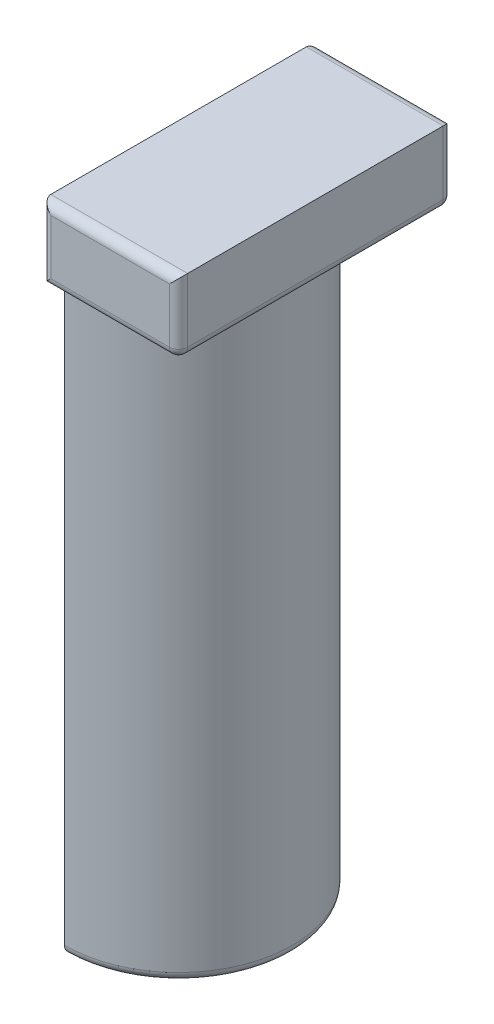
ISO-10303-21;
HEADER;
FILE_DESCRIPTION(('STEP AP214'),'2;1');
FILE_NAME('part.step','',(''),(''),'','','');
FILE_SCHEMA(('AUTOMOTIVE_DESIGN { 1 0 10303 214 1 1 1 1 }'));
ENDSEC;
DATA;
#1=APPLICATION_CONTEXT('core data for automotive mechanical design processes');
#2=APPLICATION_PROTOCOL_DEFINITION('international standard','automotive_design',2000,#1);
#3=PRODUCT_CONTEXT('',#1,'mechanical');
#4=PRODUCT('Part','Part','',(#3));
#5=PRODUCT_RELATED_PRODUCT_CATEGORY('part','',(#4));
#6=PRODUCT_DEFINITION_FORMATION('','',#4);
#7=PRODUCT_DEFINITION_CONTEXT('part definition',#1,'design');
#8=PRODUCT_DEFINITION('design','',#6,#7);
#9=PRODUCT_DEFINITION_SHAPE('','',#8);
#10=(LENGTH_UNIT() NAMED_UNIT(*) SI_UNIT(.MILLI.,.METRE.));
#11=(NAMED_UNIT(*) PLANE_ANGLE_UNIT() SI_UNIT($,.RADIAN.));
#12=(NAMED_UNIT(*) SI_UNIT($,.STERADIAN.) SOLID_ANGLE_UNIT());
#13=UNCERTAINTY_MEASURE_WITH_UNIT(LENGTH_MEASURE(1.E-05),#10,'distance_accuracy_value','');
#14=(GEOMETRIC_REPRESENTATION_CONTEXT(3) GLOBAL_UNCERTAINTY_ASSIGNED_CONTEXT((#13)) GLOBAL_UNIT_ASSIGNED_CONTEXT((#10,
#11,#12)) REPRESENTATION_CONTEXT('',''));
#15=CARTESIAN_POINT('',(0.,0.,0.));
#16=DIRECTION('',(0.,0.,1.));
#17=DIRECTION('',(1.,0.,0.));
#18=AXIS2_PLACEMENT_3D('',#15,#16,#17);
#19=CARTESIAN_POINT('',(0.,8.,0.));
#20=DIRECTION('',(-1.,0.,0.));
#21=DIRECTION('',(0.,0.,1.));
#22=AXIS2_PLACEMENT_3D('',#19,#20,#21);
#23=PLANE('',#22);
#24=DIRECTION('',(0.,0.,-1.));
#25=VECTOR('',#24,1.);
#26=CARTESIAN_POINT('',(0.,1.,0.));
#27=LINE('',#26,#25);
#28=CARTESIAN_POINT('',(0.,1.,-1.));
#29=VERTEX_POINT('',#28);
#30=CARTESIAN_POINT('',(0.,1.,-29.));
#31=VERTEX_POINT('',#30);
#32=EDGE_CURVE('E177',#29,#31,#27,.T.);
#33=ORIENTED_EDGE('',*,*,#32,.T.);
#34=DIRECTION('',(0.,-1.,0.));
#35=VECTOR('',#34,1.);
#36=CARTESIAN_POINT('',(0.,8.,-29.));
#37=LINE('',#36,#35);
#38=CARTESIAN_POINT('',(0.,8.,-29.));
#39=VERTEX_POINT('',#38);
#40=EDGE_CURVE('E181',#31,#39,#37,.F.);
#41=ORIENTED_EDGE('',*,*,#40,.T.);
#42=DIRECTION('',(0.,0.,-1.));
#43=VECTOR('',#42,1.);
#44=CARTESIAN_POINT('',(0.,8.,0.));
#45=LINE('',#44,#43);
#46=CARTESIAN_POINT('',(0.,8.,-1.));
#47=VERTEX_POINT('',#46);
#48=EDGE_CURVE('E153',#47,#39,#45,.T.);
#49=ORIENTED_EDGE('',*,*,#48,.F.);
#50=DIRECTION('',(0.,-1.,0.));
#51=VECTOR('',#50,1.);
#52=CARTESIAN_POINT('',(0.,8.,-1.));
#53=LINE('',#52,#51);
#54=EDGE_CURVE('E179',#47,#29,#53,.T.);
#55=ORIENTED_EDGE('',*,*,#54,.T.);
#56=EDGE_LOOP('',(#33,#41,#49,#55));
#57=FACE_BOUND('',#56,.T.);
#58=ADVANCED_FACE('F37',(#57),#23,.F.);
#59=CARTESIAN_POINT('',(0.,8.,-30.));
#60=DIRECTION('',(0.,0.,1.));
#61=DIRECTION('',(1.,0.,0.));
#62=AXIS2_PLACEMENT_3D('',#59,#60,#61);
#63=PLANE('',#62);
#64=DIRECTION('',(-1.,0.,0.));
#65=VECTOR('',#64,1.);
#66=CARTESIAN_POINT('',(0.,7.,-30.));
#67=LINE('',#66,#65);
#68=CARTESIAN_POINT('',(-14.,7.,-30.));
#69=VERTEX_POINT('',#68);
#70=CARTESIAN_POINT('',(-1.,7.,-30.));
#71=VERTEX_POINT('',#70);
#72=EDGE_CURVE('E172',#69,#71,#67,.F.);
#73=ORIENTED_EDGE('',*,*,#72,.T.);
#74=DIRECTION('',(0.,-1.,0.));
#75=VECTOR('',#74,1.);
#76=CARTESIAN_POINT('',(-1.,8.,-30.));
#77=LINE('',#76,#75);
#78=CARTESIAN_POINT('',(-1.,1.,-30.));
#79=VERTEX_POINT('',#78);
#80=EDGE_CURVE('E174',#71,#79,#77,.T.);
#81=ORIENTED_EDGE('',*,*,#80,.T.);
#82=DIRECTION('',(-1.,0.,0.));
#83=VECTOR('',#82,1.);
#84=CARTESIAN_POINT('',(0.,1.,-30.));
#85=LINE('',#84,#83);
#86=CARTESIAN_POINT('',(-14.,1.,-30.));
#87=VERTEX_POINT('',#86);
#88=EDGE_CURVE('E168',#79,#87,#85,.T.);
#89=ORIENTED_EDGE('',*,*,#88,.T.);
#90=DIRECTION('',(0.,1.,0.));
#91=VECTOR('',#90,1.);
#92=CARTESIAN_POINT('',(-14.,8.,-30.));
#93=LINE('',#92,#91);
#94=EDGE_CURVE('E170',#87,#69,#93,.T.);
#95=ORIENTED_EDGE('',*,*,#94,.T.);
#96=EDGE_LOOP('',(#73,#81,#89,#95));
#97=FACE_BOUND('',#96,.T.);
#98=ADVANCED_FACE('F252',(#97),#63,.F.);
#99=CARTESIAN_POINT('',(0.,8.,0.));
#100=DIRECTION('',(0.,0.,-1.));
#101=DIRECTION('',(-1.,0.,0.));
#102=AXIS2_PLACEMENT_3D('',#99,#100,#101);
#103=PLANE('',#102);
#104=DIRECTION('',(1.,0.,0.));
#105=VECTOR('',#104,1.);
#106=CARTESIAN_POINT('',(0.,1.,0.));
#107=LINE('',#106,#105);
#108=CARTESIAN_POINT('',(-14.,1.,0.));
#109=VERTEX_POINT('',#108);
#110=CARTESIAN_POINT('',(-1.,1.,0.));
#111=VERTEX_POINT('',#110);
#112=EDGE_CURVE('E46',#109,#111,#107,.T.);
#113=ORIENTED_EDGE('',*,*,#112,.T.);
#114=DIRECTION('',(0.,-1.,0.));
#115=VECTOR('',#114,1.);
#116=CARTESIAN_POINT('',(-1.,8.,0.));
#117=LINE('',#116,#115);
#118=CARTESIAN_POINT('',(-1.,7.,0.));
#119=VERTEX_POINT('',#118);
#120=EDGE_CURVE('E11',#111,#119,#117,.F.);
#121=ORIENTED_EDGE('',*,*,#120,.T.);
#122=DIRECTION('',(1.,0.,0.));
#123=VECTOR('',#122,1.);
#124=CARTESIAN_POINT('',(-15.,7.,0.));
#125=LINE('',#124,#123);
#126=CARTESIAN_POINT('',(-14.,7.,0.));
#127=VERTEX_POINT('',#126);
#128=EDGE_CURVE('E197',#119,#127,#125,.F.);
#129=ORIENTED_EDGE('',*,*,#128,.T.);
#130=DIRECTION('',(0.,1.,0.));
#131=VECTOR('',#130,1.);
#132=CARTESIAN_POINT('',(-14.,8.,0.));
#133=LINE('',#132,#131);
#134=EDGE_CURVE('E57',#127,#109,#133,.F.);
#135=ORIENTED_EDGE('',*,*,#134,.T.);
#136=EDGE_LOOP('',(#113,#121,#129,#135));
#137=FACE_BOUND('',#136,.T.);
#138=ADVANCED_FACE('F285',(#137),#103,.F.);
#139=CARTESIAN_POINT('',(0.,8.,0.));
#140=DIRECTION('',(0.,1.,0.));
#141=DIRECTION('',(0.,0.,1.));
#142=AXIS2_PLACEMENT_3D('',#139,#140,#141);
#143=PLANE('',#142);
#144=ORIENTED_EDGE('',*,*,#48,.T.);
#145=DIRECTION('',(-1.,0.,0.));
#146=VECTOR('',#145,1.);
#147=CARTESIAN_POINT('',(-15.,8.,-29.));
#148=LINE('',#147,#146);
#149=CARTESIAN_POINT('',(-15.,8.,-29.));
#150=VERTEX_POINT('',#149);
#151=EDGE_CURVE('E186',#39,#150,#148,.T.);
#152=ORIENTED_EDGE('',*,*,#151,.T.);
#153=DIRECTION('',(0.,0.,-1.));
#154=VECTOR('',#153,1.);
#155=CARTESIAN_POINT('',(-15.,8.,-30.));
#156=LINE('',#155,#154);
#157=CARTESIAN_POINT('',(-15.,8.,-0.999999999999997));
#158=VERTEX_POINT('',#157);
#159=EDGE_CURVE('E147',#158,#150,#156,.T.);
#160=ORIENTED_EDGE('',*,*,#159,.F.);
#161=DIRECTION('',(1.,0.,0.));
#162=VECTOR('',#161,1.);
#163=CARTESIAN_POINT('',(0.,8.,-1.));
#164=LINE('',#163,#162);
#165=EDGE_CURVE('E184',#158,#47,#164,.T.);
#166=ORIENTED_EDGE('',*,*,#165,.T.);
#167=EDGE_LOOP('',(#144,#152,#160,#166));
#168=FACE_BOUND('',#167,.T.);
#169=ADVANCED_FACE('F408',(#168),#143,.T.);
#170=CARTESIAN_POINT('',(0.,0.,0.));
#171=DIRECTION('',(0.,1.,0.));
#172=DIRECTION('',(0.,0.,1.));
#173=AXIS2_PLACEMENT_3D('',#170,#171,#172);
#174=PLANE('',#173);
#175=DIRECTION('',(0.,0.,-1.));
#176=VECTOR('',#175,1.);
#177=CARTESIAN_POINT('',(-15.,0.,0.));
#178=LINE('',#177,#176);
#179=CARTESIAN_POINT('',(-15.,0.,-27.5));
#180=VERTEX_POINT('',#179);
#181=CARTESIAN_POINT('',(-15.,0.,-29.));
#182=VERTEX_POINT('',#181);
#183=EDGE_CURVE('E139',#180,#182,#178,.T.);
#184=ORIENTED_EDGE('',*,*,#183,.T.);
#185=DIRECTION('',(-1.,0.,0.));
#186=VECTOR('',#185,1.);
#187=CARTESIAN_POINT('',(0.,0.,-29.));
#188=LINE('',#187,#186);
#189=CARTESIAN_POINT('',(-1.,0.,-29.));
#190=VERTEX_POINT('',#189);
#191=EDGE_CURVE('E195',#182,#190,#188,.F.);
#192=ORIENTED_EDGE('',*,*,#191,.T.);
#193=DIRECTION('',(0.,0.,-1.));
#194=VECTOR('',#193,1.);
#195=CARTESIAN_POINT('',(-1.,0.,0.));
#196=LINE('',#195,#194);
#197=CARTESIAN_POINT('',(-1.,0.,-1.));
#198=VERTEX_POINT('',#197);
#199=EDGE_CURVE('E192',#190,#198,#196,.F.);
#200=ORIENTED_EDGE('',*,*,#199,.T.);
#201=DIRECTION('',(1.,0.,0.));
#202=VECTOR('',#201,1.);
#203=CARTESIAN_POINT('',(0.,0.,-1.));
#204=LINE('',#203,#202);
#205=CARTESIAN_POINT('',(-15.,0.,-1.));
#206=VERTEX_POINT('',#205);
#207=EDGE_CURVE('E133',#198,#206,#204,.F.);
#208=ORIENTED_EDGE('',*,*,#207,.T.);
#209=CARTESIAN_POINT('',(-15.,0.,-2.5));
#210=VERTEX_POINT('',#209);
#211=EDGE_CURVE('E126',#206,#210,#178,.T.);
#212=ORIENTED_EDGE('',*,*,#211,.T.);
#213=CARTESIAN_POINT('',(-15.,0.,-15.));
#214=DIRECTION('',(0.,-1.,0.));
#215=DIRECTION('',(0.,0.,-1.));
#216=AXIS2_PLACEMENT_3D('',#213,#214,#215);
#217=CIRCLE('',#216,12.5);
#218=EDGE_CURVE('E131',#180,#210,#217,.T.);
#219=ORIENTED_EDGE('',*,*,#218,.F.);
#220=EDGE_LOOP('',(#184,#192,#200,#208,#212,#219));
#221=FACE_BOUND('',#220,.T.);
#222=ADVANCED_FACE('F129',(#221),#174,.F.);
#223=CARTESIAN_POINT('',(-15.,-65.,-15.));
#224=DIRECTION('',(0.,1.,0.));
#225=DIRECTION('',(0.,0.,1.));
#226=AXIS2_PLACEMENT_3D('',#223,#224,#225);
#227=CYLINDRICAL_SURFACE('',#226,12.5);
#228=DIRECTION('',(0.,1.,0.));
#229=VECTOR('',#228,1.);
#230=CARTESIAN_POINT('',(-15.,-65.,-2.5));
#231=LINE('',#230,#229);
#232=CARTESIAN_POINT('',(-15.,-64.,-2.5));
#233=VERTEX_POINT('',#232);
#234=EDGE_CURVE('E137',#210,#233,#231,.F.);
#235=ORIENTED_EDGE('',*,*,#234,.T.);
#236=CARTESIAN_POINT('',(-15.,-64.,-15.));
#237=DIRECTION('',(0.,-1.,0.));
#238=DIRECTION('',(0.,0.,-1.));
#239=AXIS2_PLACEMENT_3D('',#236,#237,#238);
#240=CIRCLE('',#239,12.5);
#241=CARTESIAN_POINT('',(-15.,-64.,-27.5));
#242=VERTEX_POINT('',#241);
#243=EDGE_CURVE('E166',#233,#242,#240,.F.);
#244=ORIENTED_EDGE('',*,*,#243,.T.);
#245=DIRECTION('',(0.,1.,0.));
#246=VECTOR('',#245,1.);
#247=CARTESIAN_POINT('',(-15.,-65.,-27.5));
#248=LINE('',#247,#246);
#249=EDGE_CURVE('E136',#242,#180,#248,.T.);
#250=ORIENTED_EDGE('',*,*,#249,.T.);
#251=ORIENTED_EDGE('',*,*,#218,.T.);
#252=EDGE_LOOP('',(#235,#244,#250,#251));
#253=FACE_BOUND('',#252,.T.);
#254=ADVANCED_FACE('F149',(#253),#227,.T.);
#255=CARTESIAN_POINT('',(-15.,-65.,-15.));
#256=DIRECTION('',(0.,-1.,0.));
#257=DIRECTION('',(0.,0.,-1.));
#258=AXIS2_PLACEMENT_3D('',#255,#256,#257);
#259=PLANE('',#258);
#260=DIRECTION('',(0.,0.,1.));
#261=VECTOR('',#260,1.);
#262=CARTESIAN_POINT('',(-15.,-65.,-15.));
#263=LINE('',#262,#261);
#264=CARTESIAN_POINT('',(-15.,-65.,-26.5));
#265=VERTEX_POINT('',#264);
#266=CARTESIAN_POINT('',(-15.,-65.,-3.5));
#267=VERTEX_POINT('',#266);
#268=EDGE_CURVE('E152',#265,#267,#263,.T.);
#269=ORIENTED_EDGE('',*,*,#268,.F.);
#270=CARTESIAN_POINT('',(-15.,-65.,-15.));
#271=DIRECTION('',(0.,-1.,0.));
#272=DIRECTION('',(0.,0.,-1.));
#273=AXIS2_PLACEMENT_3D('',#270,#271,#272);
#274=CIRCLE('',#273,11.5);
#275=EDGE_CURVE('E155',#265,#267,#274,.T.);
#276=ORIENTED_EDGE('',*,*,#275,.T.);
#277=EDGE_LOOP('',(#269,#276));
#278=FACE_BOUND('',#277,.T.);
#279=ADVANCED_FACE('F386',(#278),#259,.T.);
#280=CARTESIAN_POINT('',(-15.,-65.,-30.));
#281=DIRECTION('',(1.,0.,0.));
#282=DIRECTION('',(0.,1.,0.));
#283=AXIS2_PLACEMENT_3D('',#280,#281,#282);
#284=PLANE('',#283);
#285=ORIENTED_EDGE('',*,*,#159,.T.);
#286=DIRECTION('',(0.,1.,0.));
#287=VECTOR('',#286,1.);
#288=CARTESIAN_POINT('',(-15.,-65.,-29.));
#289=LINE('',#288,#287);
#290=EDGE_CURVE('E190',#150,#182,#289,.F.);
#291=ORIENTED_EDGE('',*,*,#290,.T.);
#292=ORIENTED_EDGE('',*,*,#183,.F.);
#293=ORIENTED_EDGE('',*,*,#249,.F.);
#294=CARTESIAN_POINT('',(-15.,-64.,-26.5));
#295=DIRECTION('',(1.,0.,0.));
#296=DIRECTION('',(0.,1.,0.));
#297=AXIS2_PLACEMENT_3D('',#294,#295,#296);
#298=CIRCLE('',#297,1.);
#299=EDGE_CURVE('E163',#242,#265,#298,.F.);
#300=ORIENTED_EDGE('',*,*,#299,.T.);
#301=ORIENTED_EDGE('',*,*,#268,.T.);
#302=CARTESIAN_POINT('',(-15.,-64.,-3.5));
#303=DIRECTION('',(1.,0.,0.));
#304=DIRECTION('',(0.,1.,0.));
#305=AXIS2_PLACEMENT_3D('',#302,#303,#304);
#306=CIRCLE('',#305,1.);
#307=EDGE_CURVE('E144',#267,#233,#306,.F.);
#308=ORIENTED_EDGE('',*,*,#307,.T.);
#309=ORIENTED_EDGE('',*,*,#234,.F.);
#310=ORIENTED_EDGE('',*,*,#211,.F.);
#311=DIRECTION('',(0.,1.,0.));
#312=VECTOR('',#311,1.);
#313=CARTESIAN_POINT('',(-15.,-65.,-1.));
#314=LINE('',#313,#312);
#315=EDGE_CURVE('E188',#206,#158,#314,.T.);
#316=ORIENTED_EDGE('',*,*,#315,.T.);
#317=EDGE_LOOP('',(#285,#291,#292,#293,#300,#301,#308,#309,#310,#316));
#318=FACE_BOUND('',#317,.T.);
#319=ADVANCED_FACE('F142',(#318),#284,.F.);
#320=CARTESIAN_POINT('',(-15.,-64.,-15.));
#321=DIRECTION('',(0.,-1.,0.));
#322=DIRECTION('',(0.,0.,-1.));
#323=AXIS2_PLACEMENT_3D('',#320,#321,#322);
#324=TOROIDAL_SURFACE('',#323,11.5,1.);
#325=ORIENTED_EDGE('',*,*,#299,.F.);
#326=ORIENTED_EDGE('',*,*,#243,.F.);
#327=ORIENTED_EDGE('',*,*,#307,.F.);
#328=ORIENTED_EDGE('',*,*,#275,.F.);
#329=EDGE_LOOP('',(#325,#326,#327,#328));
#330=FACE_BOUND('',#329,.T.);
#331=ADVANCED_FACE('F289',(#330),#324,.T.);
#332=CARTESIAN_POINT('',(-14.,-65.,-1.));
#333=DIRECTION('',(0.,1.,0.));
#334=DIRECTION('',(-1.,0.,0.));
#335=AXIS2_PLACEMENT_3D('',#332,#333,#334);
#336=CYLINDRICAL_SURFACE('',#335,1.);
#337=CARTESIAN_POINT('',(-14.,1.,-1.));
#338=DIRECTION('',(-0.707106781186547,0.707106781186547,0.));
#339=DIRECTION('',(0.707106781186547,0.707106781186547,0.));
#340=AXIS2_PLACEMENT_3D('',#337,#338,#339);
#341=ELLIPSE('',#340,1.41421356237309,1.);
#342=EDGE_CURVE('E227',#109,#206,#341,.F.);
#343=ORIENTED_EDGE('',*,*,#342,.F.);
#344=ORIENTED_EDGE('',*,*,#134,.F.);
#345=CARTESIAN_POINT('',(-14.,7.,-1.));
#346=DIRECTION('',(-0.707106781186547,-0.707106781186547,0.));
#347=DIRECTION('',(-0.707106781186547,0.707106781186547,0.));
#348=AXIS2_PLACEMENT_3D('',#345,#346,#347);
#349=ELLIPSE('',#348,1.41421356237309,1.);
#350=EDGE_CURVE('E41',#158,#127,#349,.F.);
#351=ORIENTED_EDGE('',*,*,#350,.F.);
#352=ORIENTED_EDGE('',*,*,#315,.F.);
#353=EDGE_LOOP('',(#343,#344,#351,#352));
#354=FACE_BOUND('',#353,.T.);
#355=ADVANCED_FACE('F39',(#354),#336,.T.);
#356=CARTESIAN_POINT('',(0.,7.,-1.));
#357=DIRECTION('',(-1.,0.,0.));
#358=DIRECTION('',(0.,0.,1.));
#359=AXIS2_PLACEMENT_3D('',#356,#357,#358);
#360=CYLINDRICAL_SURFACE('',#359,1.);
#361=ORIENTED_EDGE('',*,*,#350,.T.);
#362=ORIENTED_EDGE('',*,*,#128,.F.);
#363=CARTESIAN_POINT('',(-1.,7.,-1.));
#364=DIRECTION('',(-0.707106781186547,0.707106781186547,0.));
#365=DIRECTION('',(-0.707106781186547,-0.707106781186547,0.));
#366=AXIS2_PLACEMENT_3D('',#363,#364,#365);
#367=ELLIPSE('',#366,1.41421356237309,1.);
#368=EDGE_CURVE('E226',#47,#119,#367,.F.);
#369=ORIENTED_EDGE('',*,*,#368,.F.);
#370=ORIENTED_EDGE('',*,*,#165,.F.);
#371=EDGE_LOOP('',(#361,#362,#369,#370));
#372=FACE_BOUND('',#371,.T.);
#373=ADVANCED_FACE('F271',(#372),#360,.T.);
#374=CARTESIAN_POINT('',(0.,1.,-1.));
#375=DIRECTION('',(1.,0.,0.));
#376=DIRECTION('',(0.,0.,-1.));
#377=AXIS2_PLACEMENT_3D('',#374,#375,#376);
#378=CYLINDRICAL_SURFACE('',#377,1.);
#379=ORIENTED_EDGE('',*,*,#342,.T.);
#380=ORIENTED_EDGE('',*,*,#207,.F.);
#381=CARTESIAN_POINT('',(-1.,1.,-1.));
#382=DIRECTION('',(1.,0.,0.));
#383=DIRECTION('',(0.,0.,-1.));
#384=AXIS2_PLACEMENT_3D('',#381,#382,#383);
#385=CIRCLE('',#384,1.);
#386=EDGE_CURVE('E223',#111,#198,#385,.T.);
#387=ORIENTED_EDGE('',*,*,#386,.F.);
#388=ORIENTED_EDGE('',*,*,#112,.F.);
#389=EDGE_LOOP('',(#379,#380,#387,#388));
#390=FACE_BOUND('',#389,.T.);
#391=ADVANCED_FACE('F268',(#390),#378,.T.);
#392=CARTESIAN_POINT('',(-1.,8.,-1.));
#393=DIRECTION('',(0.,-1.,0.));
#394=DIRECTION('',(0.,0.,-1.));
#395=AXIS2_PLACEMENT_3D('',#392,#393,#394);
#396=CYLINDRICAL_SURFACE('',#395,1.);
#397=ORIENTED_EDGE('',*,*,#368,.T.);
#398=ORIENTED_EDGE('',*,*,#120,.F.);
#399=CARTESIAN_POINT('',(-1.,1.,-1.));
#400=DIRECTION('',(0.,-1.,0.));
#401=DIRECTION('',(0.,0.,-1.));
#402=AXIS2_PLACEMENT_3D('',#399,#400,#401);
#403=CIRCLE('',#402,1.);
#404=EDGE_CURVE('E220',#29,#111,#403,.T.);
#405=ORIENTED_EDGE('',*,*,#404,.F.);
#406=ORIENTED_EDGE('',*,*,#54,.F.);
#407=EDGE_LOOP('',(#397,#398,#405,#406));
#408=FACE_BOUND('',#407,.T.);
#409=ADVANCED_FACE('F270',(#408),#396,.T.);
#410=CARTESIAN_POINT('',(-1.,1.,-1.));
#411=DIRECTION('',(0.,0.,1.));
#412=DIRECTION('',(1.,0.,0.));
#413=AXIS2_PLACEMENT_3D('',#410,#411,#412);
#414=SPHERICAL_SURFACE('',#413,1.);
#415=ORIENTED_EDGE('',*,*,#404,.T.);
#416=ORIENTED_EDGE('',*,*,#386,.T.);
#417=CARTESIAN_POINT('',(-1.,1.,-1.));
#418=DIRECTION('',(0.,0.,1.));
#419=DIRECTION('',(1.,0.,0.));
#420=AXIS2_PLACEMENT_3D('',#417,#418,#419);
#421=CIRCLE('',#420,1.);
#422=EDGE_CURVE('E214',#29,#198,#421,.F.);
#423=ORIENTED_EDGE('',*,*,#422,.F.);
#424=EDGE_LOOP('',(#415,#416,#423));
#425=FACE_BOUND('',#424,.T.);
#426=ADVANCED_FACE('F265',(#425),#414,.T.);
#427=CARTESIAN_POINT('',(-14.,8.,-29.));
#428=DIRECTION('',(0.,1.,0.));
#429=DIRECTION('',(-1.,0.,0.));
#430=AXIS2_PLACEMENT_3D('',#427,#428,#429);
#431=CYLINDRICAL_SURFACE('',#430,1.);
#432=CARTESIAN_POINT('',(-14.,7.,-29.));
#433=DIRECTION('',(0.707106781186547,0.707106781186547,0.));
#434=DIRECTION('',(-0.707106781186547,0.707106781186547,0.));
#435=AXIS2_PLACEMENT_3D('',#432,#433,#434);
#436=ELLIPSE('',#435,1.41421356237309,1.);
#437=EDGE_CURVE('E211',#69,#150,#436,.T.);
#438=ORIENTED_EDGE('',*,*,#437,.F.);
#439=ORIENTED_EDGE('',*,*,#94,.F.);
#440=CARTESIAN_POINT('',(-14.,1.,-29.));
#441=DIRECTION('',(-0.707106781186547,0.707106781186547,0.));
#442=DIRECTION('',(-0.707106781186547,-0.707106781186547,0.));
#443=AXIS2_PLACEMENT_3D('',#440,#441,#442);
#444=ELLIPSE('',#443,1.41421356237309,1.);
#445=EDGE_CURVE('E217',#182,#87,#444,.F.);
#446=ORIENTED_EDGE('',*,*,#445,.F.);
#447=ORIENTED_EDGE('',*,*,#290,.F.);
#448=EDGE_LOOP('',(#438,#439,#446,#447));
#449=FACE_BOUND('',#448,.T.);
#450=ADVANCED_FACE('F242',(#449),#431,.T.);
#451=CARTESIAN_POINT('',(0.,1.,-29.));
#452=DIRECTION('',(-1.,0.,0.));
#453=DIRECTION('',(0.,0.,1.));
#454=AXIS2_PLACEMENT_3D('',#451,#452,#453);
#455=CYLINDRICAL_SURFACE('',#454,1.);
#456=ORIENTED_EDGE('',*,*,#445,.T.);
#457=ORIENTED_EDGE('',*,*,#88,.F.);
#458=CARTESIAN_POINT('',(-1.,1.,-29.));
#459=DIRECTION('',(1.,0.,0.));
#460=DIRECTION('',(0.,0.,-1.));
#461=AXIS2_PLACEMENT_3D('',#458,#459,#460);
#462=CIRCLE('',#461,1.);
#463=EDGE_CURVE('E208',#190,#79,#462,.T.);
#464=ORIENTED_EDGE('',*,*,#463,.F.);
#465=ORIENTED_EDGE('',*,*,#191,.F.);
#466=EDGE_LOOP('',(#456,#457,#464,#465));
#467=FACE_BOUND('',#466,.T.);
#468=ADVANCED_FACE('F255',(#467),#455,.T.);
#469=CARTESIAN_POINT('',(-1.,1.,0.));
#470=DIRECTION('',(0.,0.,-1.));
#471=DIRECTION('',(-1.,0.,0.));
#472=AXIS2_PLACEMENT_3D('',#469,#470,#471);
#473=CYLINDRICAL_SURFACE('',#472,1.);
#474=ORIENTED_EDGE('',*,*,#422,.T.);
#475=ORIENTED_EDGE('',*,*,#199,.F.);
#476=CARTESIAN_POINT('',(-1.,1.,-29.));
#477=DIRECTION('',(0.,0.,-1.));
#478=DIRECTION('',(-1.,0.,0.));
#479=AXIS2_PLACEMENT_3D('',#476,#477,#478);
#480=CIRCLE('',#479,1.);
#481=EDGE_CURVE('E205',#31,#190,#480,.T.);
#482=ORIENTED_EDGE('',*,*,#481,.F.);
#483=ORIENTED_EDGE('',*,*,#32,.F.);
#484=EDGE_LOOP('',(#474,#475,#482,#483));
#485=FACE_BOUND('',#484,.T.);
#486=ADVANCED_FACE('F260',(#485),#473,.T.);
#487=CARTESIAN_POINT('',(0.,7.,-29.));
#488=DIRECTION('',(1.,0.,0.));
#489=DIRECTION('',(0.,0.,-1.));
#490=AXIS2_PLACEMENT_3D('',#487,#488,#489);
#491=CYLINDRICAL_SURFACE('',#490,1.);
#492=ORIENTED_EDGE('',*,*,#437,.T.);
#493=ORIENTED_EDGE('',*,*,#151,.F.);
#494=CARTESIAN_POINT('',(-1.,7.,-29.));
#495=DIRECTION('',(0.707106781186547,-0.707106781186547,0.));
#496=DIRECTION('',(0.707106781186547,0.707106781186547,0.));
#497=AXIS2_PLACEMENT_3D('',#494,#495,#496);
#498=ELLIPSE('',#497,1.41421356237309,1.);
#499=EDGE_CURVE('E203',#71,#39,#498,.T.);
#500=ORIENTED_EDGE('',*,*,#499,.F.);
#501=ORIENTED_EDGE('',*,*,#72,.F.);
#502=EDGE_LOOP('',(#492,#493,#500,#501));
#503=FACE_BOUND('',#502,.T.);
#504=ADVANCED_FACE('F248',(#503),#491,.T.);
#505=CARTESIAN_POINT('',(-1.,1.,-29.));
#506=DIRECTION('',(0.,-1.,0.));
#507=DIRECTION('',(0.,0.,-1.));
#508=AXIS2_PLACEMENT_3D('',#505,#506,#507);
#509=SPHERICAL_SURFACE('',#508,1.);
#510=ORIENTED_EDGE('',*,*,#481,.T.);
#511=ORIENTED_EDGE('',*,*,#463,.T.);
#512=CARTESIAN_POINT('',(-1.,1.,-29.));
#513=DIRECTION('',(0.,-1.,0.));
#514=DIRECTION('',(0.,0.,-1.));
#515=AXIS2_PLACEMENT_3D('',#512,#513,#514);
#516=CIRCLE('',#515,1.);
#517=EDGE_CURVE('E201',#31,#79,#516,.F.);
#518=ORIENTED_EDGE('',*,*,#517,.F.);
#519=EDGE_LOOP('',(#510,#511,#518));
#520=FACE_BOUND('',#519,.T.);
#521=ADVANCED_FACE('F296',(#520),#509,.T.);
#522=CARTESIAN_POINT('',(-1.,8.,-29.));
#523=DIRECTION('',(0.,-1.,0.));
#524=DIRECTION('',(0.,0.,-1.));
#525=AXIS2_PLACEMENT_3D('',#522,#523,#524);
#526=CYLINDRICAL_SURFACE('',#525,1.);
#527=ORIENTED_EDGE('',*,*,#499,.T.);
#528=ORIENTED_EDGE('',*,*,#40,.F.);
#529=ORIENTED_EDGE('',*,*,#517,.T.);
#530=ORIENTED_EDGE('',*,*,#80,.F.);
#531=EDGE_LOOP('',(#527,#528,#529,#530));
#532=FACE_BOUND('',#531,.T.);
#533=ADVANCED_FACE('F293',(#532),#526,.T.);
#534=CLOSED_SHELL('',(#58,#98,#138,#169,#222,#254,#279,#319,#331,#355,#373,#391,#409,#426,#450,
#468,#486,#504,#521,#533));
#535=MANIFOLD_SOLID_BREP('B2',#534);
#536=ADVANCED_BREP_SHAPE_REPRESENTATION('',(#18,#535),#14);
#537=SHAPE_DEFINITION_REPRESENTATION(#9,#536);
ENDSEC;
END-ISO-10303-21;
